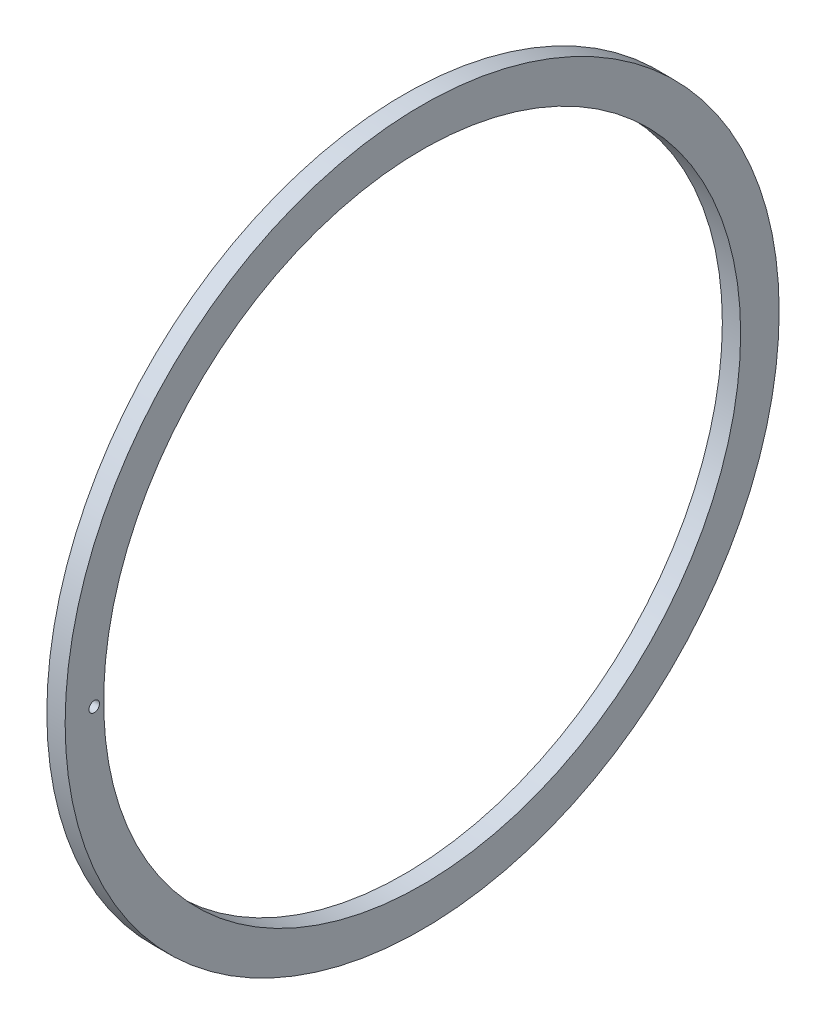
ISO-10303-21;
HEADER;
FILE_DESCRIPTION(('STEP AP214'),'2;1');
FILE_NAME('part.step','',(''),(''),'','','');
FILE_SCHEMA(('AUTOMOTIVE_DESIGN { 1 0 10303 214 1 1 1 1 }'));
ENDSEC;
DATA;
#1=APPLICATION_CONTEXT('core data for automotive mechanical design processes');
#2=APPLICATION_PROTOCOL_DEFINITION('international standard','automotive_design',2000,#1);
#3=PRODUCT_CONTEXT('',#1,'mechanical');
#4=PRODUCT('Part','Part','',(#3));
#5=PRODUCT_RELATED_PRODUCT_CATEGORY('part','',(#4));
#6=PRODUCT_DEFINITION_FORMATION('','',#4);
#7=PRODUCT_DEFINITION_CONTEXT('part definition',#1,'design');
#8=PRODUCT_DEFINITION('design','',#6,#7);
#9=PRODUCT_DEFINITION_SHAPE('','',#8);
#10=(LENGTH_UNIT() NAMED_UNIT(*) SI_UNIT(.MILLI.,.METRE.));
#11=(NAMED_UNIT(*) PLANE_ANGLE_UNIT() SI_UNIT($,.RADIAN.));
#12=(NAMED_UNIT(*) SI_UNIT($,.STERADIAN.) SOLID_ANGLE_UNIT());
#13=UNCERTAINTY_MEASURE_WITH_UNIT(LENGTH_MEASURE(1.E-05),#10,'distance_accuracy_value','');
#14=(GEOMETRIC_REPRESENTATION_CONTEXT(3) GLOBAL_UNCERTAINTY_ASSIGNED_CONTEXT((#13)) GLOBAL_UNIT_ASSIGNED_CONTEXT((#10,
#11,#12)) REPRESENTATION_CONTEXT('',''));
#15=CARTESIAN_POINT('',(0.,0.,0.));
#16=DIRECTION('',(0.,0.,1.));
#17=DIRECTION('',(1.,0.,0.));
#18=AXIS2_PLACEMENT_3D('',#15,#16,#17);
#19=CARTESIAN_POINT('',(10.,0.,0.));
#20=DIRECTION('',(1.,0.,0.));
#21=DIRECTION('',(0.,0.,-1.));
#22=AXIS2_PLACEMENT_3D('',#19,#20,#21);
#23=PLANE('',#22);
#24=CARTESIAN_POINT('',(10.,0.,0.));
#25=DIRECTION('',(1.,0.,0.));
#26=DIRECTION('',(0.,0.,-1.));
#27=AXIS2_PLACEMENT_3D('',#24,#25,#26);
#28=CIRCLE('',#27,173.961);
#29=CARTESIAN_POINT('',(10.,0.,-173.961));
#30=VERTEX_POINT('',#29);
#31=EDGE_CURVE('E48',#30,#30,#28,.T.);
#32=ORIENTED_EDGE('',*,*,#31,.F.);
#33=EDGE_LOOP('',(#32));
#34=FACE_BOUND('',#33,.T.);
#35=CARTESIAN_POINT('',(10.,0.,0.));
#36=DIRECTION('',(1.,0.,0.));
#37=DIRECTION('',(0.,0.,-1.));
#38=AXIS2_PLACEMENT_3D('',#35,#36,#37);
#39=CIRCLE('',#38,195.);
#40=CARTESIAN_POINT('',(10.,0.,-195.));
#41=VERTEX_POINT('',#40);
#42=EDGE_CURVE('E10',#41,#41,#39,.T.);
#43=ORIENTED_EDGE('',*,*,#42,.T.);
#44=EDGE_LOOP('',(#43));
#45=FACE_BOUND('',#44,.T.);
#46=CARTESIAN_POINT('',(10.,0.,179.1136862));
#47=DIRECTION('',(1.,0.,0.));
#48=DIRECTION('',(0.,0.,-1.));
#49=AXIS2_PLACEMENT_3D('',#46,#47,#48);
#50=CIRCLE('',#49,2.89934999999999);
#51=CARTESIAN_POINT('',(10.,0.,176.2143362));
#52=VERTEX_POINT('',#51);
#53=EDGE_CURVE('E43',#52,#52,#50,.T.);
#54=ORIENTED_EDGE('',*,*,#53,.F.);
#55=EDGE_LOOP('',(#54));
#56=FACE_BOUND('',#55,.T.);
#57=ADVANCED_FACE('F32',(#34,#45,#56),#23,.T.);
#58=CARTESIAN_POINT('',(0.,0.,0.));
#59=DIRECTION('',(1.,0.,0.));
#60=DIRECTION('',(0.,0.,-1.));
#61=AXIS2_PLACEMENT_3D('',#58,#59,#60);
#62=PLANE('',#61);
#63=CARTESIAN_POINT('',(0.,0.,0.));
#64=DIRECTION('',(1.,0.,0.));
#65=DIRECTION('',(0.,0.,-1.));
#66=AXIS2_PLACEMENT_3D('',#63,#64,#65);
#67=CIRCLE('',#66,173.961);
#68=CARTESIAN_POINT('',(0.,0.,-173.961));
#69=VERTEX_POINT('',#68);
#70=EDGE_CURVE('E53',#69,#69,#67,.T.);
#71=ORIENTED_EDGE('',*,*,#70,.T.);
#72=EDGE_LOOP('',(#71));
#73=FACE_BOUND('',#72,.T.);
#74=CARTESIAN_POINT('',(0.,0.,0.));
#75=DIRECTION('',(1.,0.,0.));
#76=DIRECTION('',(0.,0.,-1.));
#77=AXIS2_PLACEMENT_3D('',#74,#75,#76);
#78=CIRCLE('',#77,195.);
#79=CARTESIAN_POINT('',(0.,0.,-195.));
#80=VERTEX_POINT('',#79);
#81=EDGE_CURVE('E36',#80,#80,#78,.T.);
#82=ORIENTED_EDGE('',*,*,#81,.F.);
#83=EDGE_LOOP('',(#82));
#84=FACE_BOUND('',#83,.T.);
#85=CARTESIAN_POINT('',(0.,0.,179.1136862));
#86=DIRECTION('',(1.,0.,0.));
#87=DIRECTION('',(0.,0.,-1.));
#88=AXIS2_PLACEMENT_3D('',#85,#86,#87);
#89=CIRCLE('',#88,2.89934999999999);
#90=CARTESIAN_POINT('',(0.,0.,176.2143362));
#91=VERTEX_POINT('',#90);
#92=EDGE_CURVE('E45',#91,#91,#89,.T.);
#93=ORIENTED_EDGE('',*,*,#92,.T.);
#94=EDGE_LOOP('',(#93));
#95=FACE_BOUND('',#94,.T.);
#96=ADVANCED_FACE('F57',(#73,#84,#95),#62,.F.);
#97=CARTESIAN_POINT('',(10.,0.,0.));
#98=DIRECTION('',(-1.,0.,0.));
#99=DIRECTION('',(0.,0.,1.));
#100=AXIS2_PLACEMENT_3D('',#97,#98,#99);
#101=CYLINDRICAL_SURFACE('',#100,195.);
#102=ORIENTED_EDGE('',*,*,#42,.F.);
#103=EDGE_LOOP('',(#102));
#104=FACE_BOUND('',#103,.T.);
#105=ORIENTED_EDGE('',*,*,#81,.T.);
#106=EDGE_LOOP('',(#105));
#107=FACE_BOUND('',#106,.T.);
#108=ADVANCED_FACE('F34',(#104,#107),#101,.T.);
#109=CARTESIAN_POINT('',(10.,0.,179.1136862));
#110=DIRECTION('',(-1.,0.,0.));
#111=DIRECTION('',(0.,0.,1.));
#112=AXIS2_PLACEMENT_3D('',#109,#110,#111);
#113=CYLINDRICAL_SURFACE('',#112,2.89934999999999);
#114=ORIENTED_EDGE('',*,*,#53,.T.);
#115=EDGE_LOOP('',(#114));
#116=FACE_BOUND('',#115,.T.);
#117=ORIENTED_EDGE('',*,*,#92,.F.);
#118=EDGE_LOOP('',(#117));
#119=FACE_BOUND('',#118,.T.);
#120=ADVANCED_FACE('F62',(#116,#119),#113,.F.);
#121=CARTESIAN_POINT('',(0.,0.,0.));
#122=DIRECTION('',(1.,0.,0.));
#123=DIRECTION('',(0.,0.,-1.));
#124=AXIS2_PLACEMENT_3D('',#121,#122,#123);
#125=CYLINDRICAL_SURFACE('',#124,173.961);
#126=ORIENTED_EDGE('',*,*,#31,.T.);
#127=EDGE_LOOP('',(#126));
#128=FACE_BOUND('',#127,.T.);
#129=ORIENTED_EDGE('',*,*,#70,.F.);
#130=EDGE_LOOP('',(#129));
#131=FACE_BOUND('',#130,.T.);
#132=ADVANCED_FACE('F60',(#128,#131),#125,.F.);
#133=CLOSED_SHELL('',(#57,#96,#108,#120,#132));
#134=MANIFOLD_SOLID_BREP('B2',#133);
#135=ADVANCED_BREP_SHAPE_REPRESENTATION('',(#18,#134),#14);
#136=SHAPE_DEFINITION_REPRESENTATION(#9,#135);
ENDSEC;
END-ISO-10303-21;
